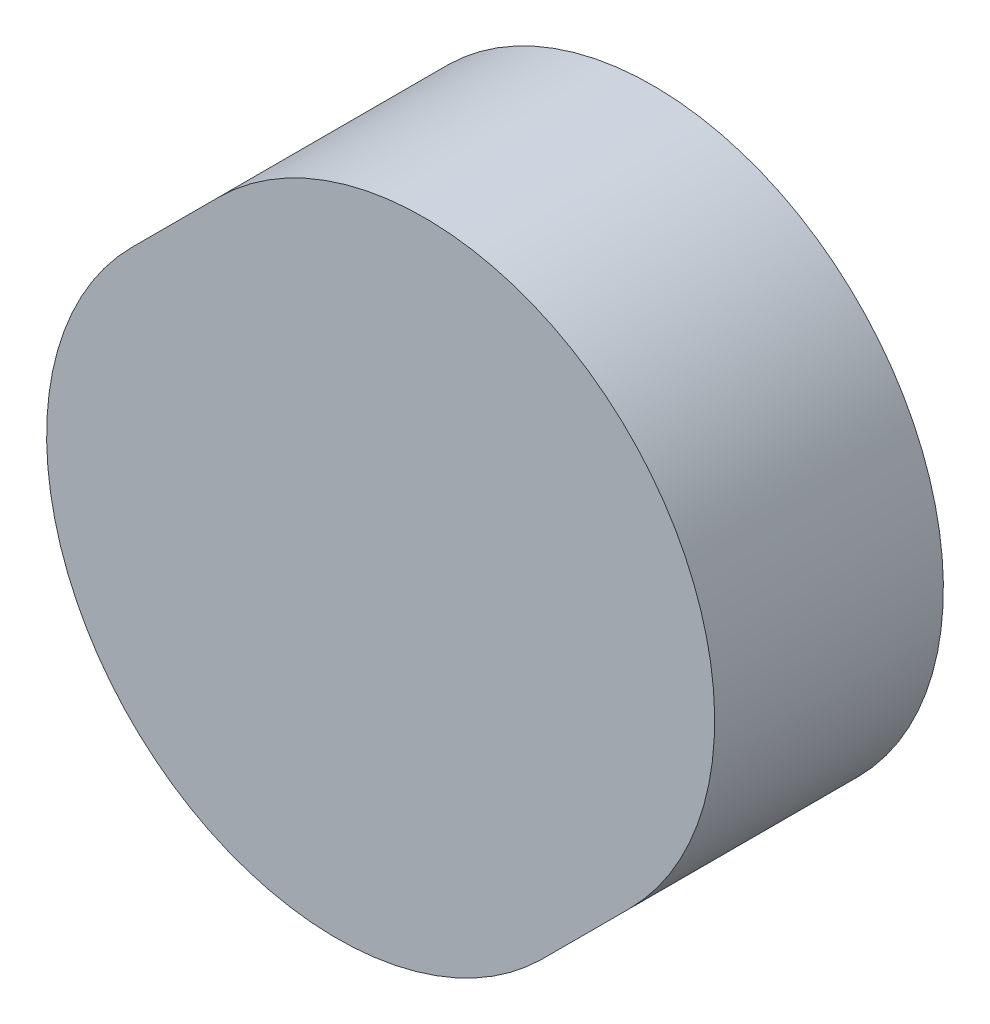
ISO-10303-21;
HEADER;
FILE_DESCRIPTION(('STEP AP214'),'2;1');
FILE_NAME('part.step','',(''),(''),'','','');
FILE_SCHEMA(('AUTOMOTIVE_DESIGN { 1 0 10303 214 1 1 1 1 }'));
ENDSEC;
DATA;
#1=APPLICATION_CONTEXT('core data for automotive mechanical design processes');
#2=APPLICATION_PROTOCOL_DEFINITION('international standard','automotive_design',2000,#1);
#3=PRODUCT_CONTEXT('',#1,'mechanical');
#4=PRODUCT('Part','Part','',(#3));
#5=PRODUCT_RELATED_PRODUCT_CATEGORY('part','',(#4));
#6=PRODUCT_DEFINITION_FORMATION('','',#4);
#7=PRODUCT_DEFINITION_CONTEXT('part definition',#1,'design');
#8=PRODUCT_DEFINITION('design','',#6,#7);
#9=PRODUCT_DEFINITION_SHAPE('','',#8);
#10=(LENGTH_UNIT() NAMED_UNIT(*) SI_UNIT(.MILLI.,.METRE.));
#11=(NAMED_UNIT(*) PLANE_ANGLE_UNIT() SI_UNIT($,.RADIAN.));
#12=(NAMED_UNIT(*) SI_UNIT($,.STERADIAN.) SOLID_ANGLE_UNIT());
#13=UNCERTAINTY_MEASURE_WITH_UNIT(LENGTH_MEASURE(1.E-05),#10,'distance_accuracy_value','');
#14=(GEOMETRIC_REPRESENTATION_CONTEXT(3) GLOBAL_UNCERTAINTY_ASSIGNED_CONTEXT((#13)) GLOBAL_UNIT_ASSIGNED_CONTEXT((#10,
#11,#12)) REPRESENTATION_CONTEXT('',''));
#15=CARTESIAN_POINT('',(0.,0.,0.));
#16=DIRECTION('',(0.,0.,1.));
#17=DIRECTION('',(1.,0.,0.));
#18=AXIS2_PLACEMENT_3D('',#15,#16,#17);
#19=CARTESIAN_POINT('',(110.84740594,66.29219406,0.));
#20=DIRECTION('',(-0.707106781186548,0.707106781186548,0.));
#21=DIRECTION('',(0.707106781186548,0.707106781186548,0.));
#22=AXIS2_PLACEMENT_3D('',#19,#20,#21);
#23=PLANE('',#22);
#24=DIRECTION('',(0.707106781186548,0.707106781186548,0.));
#25=VECTOR('',#24,1.);
#26=CARTESIAN_POINT('',(110.84740594,66.29219406,0.1999996));
#27=LINE('',#26,#25);
#28=CARTESIAN_POINT('',(110.84740594,66.29219406,0.1999996));
#29=VERTEX_POINT('',#28);
#30=CARTESIAN_POINT('',(110.92360594,66.36839406,0.1999996));
#31=VERTEX_POINT('',#30);
#32=EDGE_CURVE('E11',#29,#31,#27,.T.);
#33=ORIENTED_EDGE('',*,*,#32,.F.);
#34=DIRECTION('',(0.,0.,1.));
#35=VECTOR('',#34,1.);
#36=CARTESIAN_POINT('',(110.84740594,66.29219406,0.));
#37=LINE('',#36,#35);
#38=CARTESIAN_POINT('',(110.84740594,66.29219406,0.));
#39=VERTEX_POINT('',#38);
#40=EDGE_CURVE('E24',#39,#29,#37,.T.);
#41=ORIENTED_EDGE('',*,*,#40,.F.);
#42=DIRECTION('',(0.707106781186548,0.707106781186548,0.));
#43=VECTOR('',#42,1.);
#44=CARTESIAN_POINT('',(110.84740594,66.29219406,0.));
#45=LINE('',#44,#43);
#46=CARTESIAN_POINT('',(110.92360594,66.36839406,0.));
#47=VERTEX_POINT('',#46);
#48=EDGE_CURVE('E75',#39,#47,#45,.T.);
#49=ORIENTED_EDGE('',*,*,#48,.T.);
#50=DIRECTION('',(0.,0.,1.));
#51=VECTOR('',#50,1.);
#52=CARTESIAN_POINT('',(110.92360594,66.36839406,0.));
#53=LINE('',#52,#51);
#54=EDGE_CURVE('E37',#47,#31,#53,.T.);
#55=ORIENTED_EDGE('',*,*,#54,.T.);
#56=EDGE_LOOP('',(#33,#41,#49,#55));
#57=FACE_BOUND('',#56,.T.);
#58=ADVANCED_FACE('F17',(#57),#23,.F.);
#59=CARTESIAN_POINT('',(110.744,66.548,0.));
#60=DIRECTION('',(0.,0.,-1.));
#61=DIRECTION('',(0.707106781186548,-0.707106781186548,0.));
#62=AXIS2_PLACEMENT_3D('',#59,#60,#61);
#63=CYLINDRICAL_SURFACE('',#62,0.254001156230771);
#64=CARTESIAN_POINT('',(110.744,66.548,0.1999996));
#65=DIRECTION('',(0.,0.,1.));
#66=DIRECTION('',(0.707106781186548,-0.707106781186548,0.));
#67=AXIS2_PLACEMENT_3D('',#64,#65,#66);
#68=CIRCLE('',#67,0.254001156230771);
#69=CARTESIAN_POINT('',(110.56439406,66.72760594,0.1999996));
#70=VERTEX_POINT('',#69);
#71=EDGE_CURVE('E83',#31,#70,#68,.T.);
#72=ORIENTED_EDGE('',*,*,#71,.F.);
#73=ORIENTED_EDGE('',*,*,#54,.F.);
#74=CARTESIAN_POINT('',(110.744,66.548,0.));
#75=DIRECTION('',(0.,0.,1.));
#76=DIRECTION('',(0.707106781186548,-0.707106781186548,0.));
#77=AXIS2_PLACEMENT_3D('',#74,#75,#76);
#78=CIRCLE('',#77,0.254001156230771);
#79=CARTESIAN_POINT('',(110.56439406,66.72760594,0.));
#80=VERTEX_POINT('',#79);
#81=EDGE_CURVE('E81',#47,#80,#78,.T.);
#82=ORIENTED_EDGE('',*,*,#81,.T.);
#83=DIRECTION('',(0.,0.,1.));
#84=VECTOR('',#83,1.);
#85=CARTESIAN_POINT('',(110.56439406,66.72760594,0.));
#86=LINE('',#85,#84);
#87=EDGE_CURVE('E67',#80,#70,#86,.T.);
#88=ORIENTED_EDGE('',*,*,#87,.T.);
#89=EDGE_LOOP('',(#72,#73,#82,#88));
#90=FACE_BOUND('',#89,.T.);
#91=ADVANCED_FACE('F89',(#90),#63,.T.);
#92=CARTESIAN_POINT('',(110.56439406,66.72760594,0.));
#93=DIRECTION('',(0.707106781186548,-0.707106781186548,0.));
#94=DIRECTION('',(-0.707106781186548,-0.707106781186548,0.));
#95=AXIS2_PLACEMENT_3D('',#92,#93,#94);
#96=PLANE('',#95);
#97=DIRECTION('',(-0.707106781186548,-0.707106781186548,0.));
#98=VECTOR('',#97,1.);
#99=CARTESIAN_POINT('',(110.56439406,66.72760594,0.1999996));
#100=LINE('',#99,#98);
#101=CARTESIAN_POINT('',(110.48819406,66.65140594,0.1999996));
#102=VERTEX_POINT('',#101);
#103=EDGE_CURVE('E71',#70,#102,#100,.T.);
#104=ORIENTED_EDGE('',*,*,#103,.F.);
#105=ORIENTED_EDGE('',*,*,#87,.F.);
#106=DIRECTION('',(-0.707106781186548,-0.707106781186548,0.));
#107=VECTOR('',#106,1.);
#108=CARTESIAN_POINT('',(110.56439406,66.72760594,0.));
#109=LINE('',#108,#107);
#110=CARTESIAN_POINT('',(110.48819406,66.65140594,0.));
#111=VERTEX_POINT('',#110);
#112=EDGE_CURVE('E63',#80,#111,#109,.T.);
#113=ORIENTED_EDGE('',*,*,#112,.T.);
#114=DIRECTION('',(0.,0.,1.));
#115=VECTOR('',#114,1.);
#116=CARTESIAN_POINT('',(110.48819406,66.65140594,0.));
#117=LINE('',#116,#115);
#118=EDGE_CURVE('E53',#111,#102,#117,.T.);
#119=ORIENTED_EDGE('',*,*,#118,.T.);
#120=EDGE_LOOP('',(#104,#105,#113,#119));
#121=FACE_BOUND('',#120,.T.);
#122=ADVANCED_FACE('F66',(#121),#96,.F.);
#123=CARTESIAN_POINT('',(110.6678,66.4718,0.));
#124=DIRECTION('',(0.,0.,-1.));
#125=DIRECTION('',(-0.707106781186548,0.707106781186548,0.));
#126=AXIS2_PLACEMENT_3D('',#123,#124,#125);
#127=CYLINDRICAL_SURFACE('',#126,0.254001156230771);
#128=CARTESIAN_POINT('',(110.6678,66.4718,0.1999996));
#129=DIRECTION('',(0.,0.,1.));
#130=DIRECTION('',(-0.707106781186548,0.707106781186548,0.));
#131=AXIS2_PLACEMENT_3D('',#128,#129,#130);
#132=CIRCLE('',#131,0.254001156230771);
#133=EDGE_CURVE('E59',#102,#29,#132,.T.);
#134=ORIENTED_EDGE('',*,*,#133,.F.);
#135=ORIENTED_EDGE('',*,*,#118,.F.);
#136=CARTESIAN_POINT('',(110.6678,66.4718,0.));
#137=DIRECTION('',(0.,0.,1.));
#138=DIRECTION('',(-0.707106781186548,0.707106781186548,0.));
#139=AXIS2_PLACEMENT_3D('',#136,#137,#138);
#140=CIRCLE('',#139,0.254001156230771);
#141=EDGE_CURVE('E57',#111,#39,#140,.T.);
#142=ORIENTED_EDGE('',*,*,#141,.T.);
#143=ORIENTED_EDGE('',*,*,#40,.T.);
#144=EDGE_LOOP('',(#134,#135,#142,#143));
#145=FACE_BOUND('',#144,.T.);
#146=ADVANCED_FACE('F55',(#145),#127,.T.);
#147=CARTESIAN_POINT('',(110.84740594,66.29219406,0.));
#148=DIRECTION('',(0.,0.,-1.));
#149=DIRECTION('',(-1.,0.,0.));
#150=AXIS2_PLACEMENT_3D('',#147,#148,#149);
#151=PLANE('',#150);
#152=ORIENTED_EDGE('',*,*,#141,.F.);
#153=ORIENTED_EDGE('',*,*,#112,.F.);
#154=ORIENTED_EDGE('',*,*,#81,.F.);
#155=ORIENTED_EDGE('',*,*,#48,.F.);
#156=EDGE_LOOP('',(#152,#153,#154,#155));
#157=FACE_BOUND('',#156,.T.);
#158=ADVANCED_FACE('F74',(#157),#151,.T.);
#159=CARTESIAN_POINT('',(110.84740594,66.29219406,0.1999996));
#160=DIRECTION('',(0.,0.,-1.));
#161=DIRECTION('',(-1.,0.,0.));
#162=AXIS2_PLACEMENT_3D('',#159,#160,#161);
#163=PLANE('',#162);
#164=ORIENTED_EDGE('',*,*,#32,.T.);
#165=ORIENTED_EDGE('',*,*,#71,.T.);
#166=ORIENTED_EDGE('',*,*,#103,.T.);
#167=ORIENTED_EDGE('',*,*,#133,.T.);
#168=EDGE_LOOP('',(#164,#165,#166,#167));
#169=FACE_BOUND('',#168,.T.);
#170=ADVANCED_FACE('F91',(#169),#163,.F.);
#171=CLOSED_SHELL('',(#58,#91,#122,#146,#158,#170));
#172=MANIFOLD_SOLID_BREP('B1',#171);
#173=ADVANCED_BREP_SHAPE_REPRESENTATION('',(#18,#172),#14);
#174=SHAPE_DEFINITION_REPRESENTATION(#9,#173);
ENDSEC;
END-ISO-10303-21;
